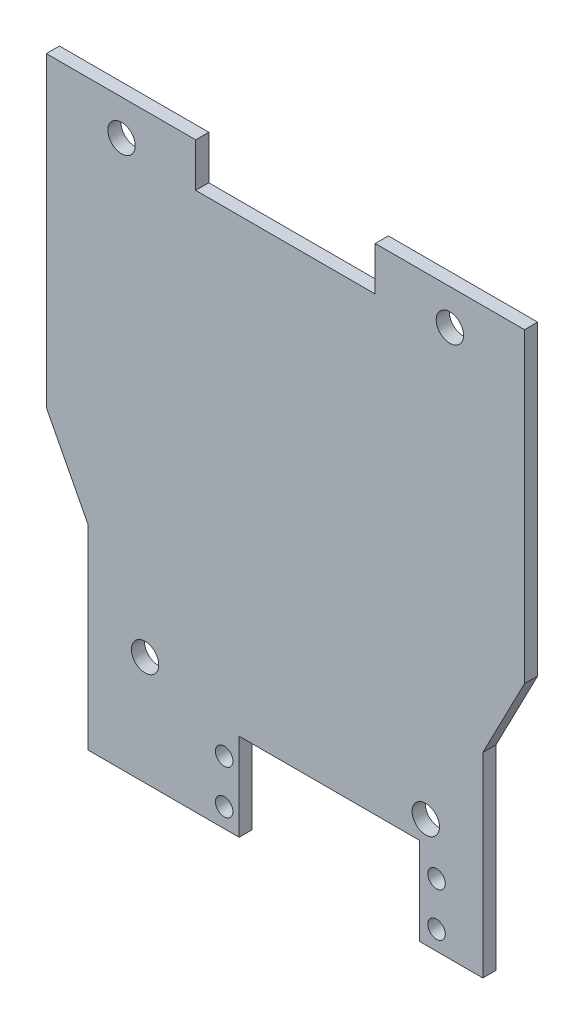
ISO-10303-21;
HEADER;
FILE_DESCRIPTION(('STEP AP214'),'2;1');
FILE_NAME('part.step','',(''),(''),'','','');
FILE_SCHEMA(('AUTOMOTIVE_DESIGN { 1 0 10303 214 1 1 1 1 }'));
ENDSEC;
DATA;
#1=APPLICATION_CONTEXT('core data for automotive mechanical design processes');
#2=APPLICATION_PROTOCOL_DEFINITION('international standard','automotive_design',2000,#1);
#3=PRODUCT_CONTEXT('',#1,'mechanical');
#4=PRODUCT('Part','Part','',(#3));
#5=PRODUCT_RELATED_PRODUCT_CATEGORY('part','',(#4));
#6=PRODUCT_DEFINITION_FORMATION('','',#4);
#7=PRODUCT_DEFINITION_CONTEXT('part definition',#1,'design');
#8=PRODUCT_DEFINITION('design','',#6,#7);
#9=PRODUCT_DEFINITION_SHAPE('','',#8);
#10=(LENGTH_UNIT() NAMED_UNIT(*) SI_UNIT(.MILLI.,.METRE.));
#11=(NAMED_UNIT(*) PLANE_ANGLE_UNIT() SI_UNIT($,.RADIAN.));
#12=(NAMED_UNIT(*) SI_UNIT($,.STERADIAN.) SOLID_ANGLE_UNIT());
#13=UNCERTAINTY_MEASURE_WITH_UNIT(LENGTH_MEASURE(1.E-05),#10,'distance_accuracy_value','');
#14=(GEOMETRIC_REPRESENTATION_CONTEXT(3) GLOBAL_UNCERTAINTY_ASSIGNED_CONTEXT((#13)) GLOBAL_UNIT_ASSIGNED_CONTEXT((#10,
#11,#12)) REPRESENTATION_CONTEXT('',''));
#15=CARTESIAN_POINT('',(0.,0.,0.));
#16=DIRECTION('',(0.,0.,1.));
#17=DIRECTION('',(1.,0.,0.));
#18=AXIS2_PLACEMENT_3D('',#15,#16,#17);
#19=CARTESIAN_POINT('',(0.,0.,3.));
#20=DIRECTION('',(0.,0.,1.));
#21=DIRECTION('',(1.,0.,0.));
#22=AXIS2_PLACEMENT_3D('',#19,#20,#21);
#23=PLANE('',#22);
#24=CARTESIAN_POINT('',(69.5000001755449,-100.000011832947,3.));
#25=DIRECTION('',(0.,0.,1.));
#26=DIRECTION('',(1.,0.,0.));
#27=AXIS2_PLACEMENT_3D('',#24,#25,#26);
#28=CIRCLE('',#27,3.125);
#29=CARTESIAN_POINT('',(66.3750001755449,-100.000011832947,3.));
#30=VERTEX_POINT('',#29);
#31=EDGE_CURVE('E408',#30,#30,#28,.F.);
#32=ORIENTED_EDGE('',*,*,#31,.T.);
#33=EDGE_LOOP('',(#32));
#34=FACE_BOUND('',#33,.T.);
#35=CARTESIAN_POINT('',(5.38797365053294,-100.000011832947,3.));
#36=DIRECTION('',(0.,0.,1.));
#37=DIRECTION('',(1.,0.,0.));
#38=AXIS2_PLACEMENT_3D('',#35,#36,#37);
#39=CIRCLE('',#38,3.125);
#40=CARTESIAN_POINT('',(2.26297365053294,-100.000011832947,3.));
#41=VERTEX_POINT('',#40);
#42=EDGE_CURVE('E420',#41,#41,#39,.F.);
#43=ORIENTED_EDGE('',*,*,#42,.T.);
#44=EDGE_LOOP('',(#43));
#45=FACE_BOUND('',#44,.T.);
#46=CARTESIAN_POINT('',(71.9515141755449,-110.541227832947,3.));
#47=DIRECTION('',(0.,0.,1.));
#48=DIRECTION('',(1.,0.,0.));
#49=AXIS2_PLACEMENT_3D('',#46,#47,#48);
#50=CIRCLE('',#49,2.);
#51=CARTESIAN_POINT('',(73.9515141755449,-110.541227832947,3.));
#52=VERTEX_POINT('',#51);
#53=EDGE_CURVE('E435',#52,#52,#50,.T.);
#54=ORIENTED_EDGE('',*,*,#53,.F.);
#55=EDGE_LOOP('',(#54));
#56=FACE_BOUND('',#55,.T.);
#57=CARTESIAN_POINT('',(23.4551051755449,-120.540427832947,3.));
#58=DIRECTION('',(0.,0.,1.));
#59=DIRECTION('',(1.,0.,0.));
#60=AXIS2_PLACEMENT_3D('',#57,#58,#59);
#61=CIRCLE('',#60,2.);
#62=CARTESIAN_POINT('',(25.4551051755449,-120.540427832947,3.));
#63=VERTEX_POINT('',#62);
#64=EDGE_CURVE('E436',#63,#63,#61,.T.);
#65=ORIENTED_EDGE('',*,*,#64,.F.);
#66=EDGE_LOOP('',(#65));
#67=FACE_BOUND('',#66,.T.);
#68=CARTESIAN_POINT('',(23.4551051755449,-110.541227832947,3.));
#69=DIRECTION('',(0.,0.,1.));
#70=DIRECTION('',(1.,0.,0.));
#71=AXIS2_PLACEMENT_3D('',#68,#69,#70);
#72=CIRCLE('',#71,2.);
#73=CARTESIAN_POINT('',(25.4551051755449,-110.541227832947,3.));
#74=VERTEX_POINT('',#73);
#75=EDGE_CURVE('E415',#74,#74,#72,.T.);
#76=ORIENTED_EDGE('',*,*,#75,.F.);
#77=EDGE_LOOP('',(#76));
#78=FACE_BOUND('',#77,.T.);
#79=CARTESIAN_POINT('',(71.9515141755449,-120.540427832947,3.));
#80=DIRECTION('',(0.,0.,1.));
#81=DIRECTION('',(1.,0.,0.));
#82=AXIS2_PLACEMENT_3D('',#79,#80,#81);
#83=CIRCLE('',#82,2.);
#84=CARTESIAN_POINT('',(73.9515141755449,-120.540427832947,3.));
#85=VERTEX_POINT('',#84);
#86=EDGE_CURVE('E440',#85,#85,#83,.T.);
#87=ORIENTED_EDGE('',*,*,#86,.F.);
#88=EDGE_LOOP('',(#87));
#89=FACE_BOUND('',#88,.T.);
#90=CARTESIAN_POINT('',(0.,0.,3.));
#91=DIRECTION('',(0.,0.,1.));
#92=DIRECTION('',(1.,0.,0.));
#93=AXIS2_PLACEMENT_3D('',#90,#91,#92);
#94=CIRCLE('',#93,3.125);
#95=CARTESIAN_POINT('',(3.125,0.,3.));
#96=VERTEX_POINT('',#95);
#97=EDGE_CURVE('E198',#96,#96,#94,.T.);
#98=ORIENTED_EDGE('',*,*,#97,.F.);
#99=EDGE_LOOP('',(#98));
#100=FACE_BOUND('',#99,.T.);
#101=DIRECTION('',(0.460085189661365,0.887874776223689,0.));
#102=VECTOR('',#101,1.);
#103=CARTESIAN_POINT('',(92.055,-61.8979118329466,3.));
#104=LINE('',#103,#102);
#105=CARTESIAN_POINT('',(82.5251141755449,-80.2887347369683,3.));
#106=VERTEX_POINT('',#105);
#107=CARTESIAN_POINT('',(92.055,-61.8979118329466,3.));
#108=VERTEX_POINT('',#107);
#109=EDGE_CURVE('E240',#106,#108,#104,.T.);
#110=ORIENTED_EDGE('',*,*,#109,.T.);
#111=DIRECTION('',(0.,1.,0.));
#112=VECTOR('',#111,1.);
#113=CARTESIAN_POINT('',(92.055,8.10208816705338,3.));
#114=LINE('',#113,#112);
#115=CARTESIAN_POINT('',(92.055,8.10208816705338,3.));
#116=VERTEX_POINT('',#115);
#117=EDGE_CURVE('E128',#108,#116,#114,.T.);
#118=ORIENTED_EDGE('',*,*,#117,.T.);
#119=DIRECTION('',(-1.,0.,0.));
#120=VECTOR('',#119,1.);
#121=CARTESIAN_POINT('',(57.945,8.10208816705338,3.));
#122=LINE('',#121,#120);
#123=CARTESIAN_POINT('',(57.945,8.10208816705338,3.));
#124=VERTEX_POINT('',#123);
#125=EDGE_CURVE('E293',#116,#124,#122,.T.);
#126=ORIENTED_EDGE('',*,*,#125,.T.);
#127=DIRECTION('',(0.,-1.,0.));
#128=VECTOR('',#127,1.);
#129=CARTESIAN_POINT('',(57.945,-1.89791183294662,3.));
#130=LINE('',#129,#128);
#131=CARTESIAN_POINT('',(57.945,-1.89791183294662,3.));
#132=VERTEX_POINT('',#131);
#133=EDGE_CURVE('E313',#124,#132,#130,.T.);
#134=ORIENTED_EDGE('',*,*,#133,.T.);
#135=DIRECTION('',(-1.,0.,0.));
#136=VECTOR('',#135,1.);
#137=CARTESIAN_POINT('',(16.9429738260778,-1.89791183294662,3.));
#138=LINE('',#137,#136);
#139=CARTESIAN_POINT('',(16.9429738260778,-1.89791183294662,3.));
#140=VERTEX_POINT('',#139);
#141=EDGE_CURVE('E309',#132,#140,#138,.T.);
#142=ORIENTED_EDGE('',*,*,#141,.T.);
#143=DIRECTION('',(0.,1.,0.));
#144=VECTOR('',#143,1.);
#145=CARTESIAN_POINT('',(16.9429738260778,-1.89791183294662,3.));
#146=LINE('',#145,#144);
#147=CARTESIAN_POINT('',(16.9429738260778,8.10208816705338,3.));
#148=VERTEX_POINT('',#147);
#149=EDGE_CURVE('E312',#140,#148,#146,.T.);
#150=ORIENTED_EDGE('',*,*,#149,.T.);
#151=DIRECTION('',(-1.,0.,0.));
#152=VECTOR('',#151,1.);
#153=CARTESIAN_POINT('',(-17.1710785217665,8.10208816705338,3.));
#154=LINE('',#153,#152);
#155=CARTESIAN_POINT('',(-17.1710785217665,8.10208816705338,3.));
#156=VERTEX_POINT('',#155);
#157=EDGE_CURVE('E317',#148,#156,#154,.T.);
#158=ORIENTED_EDGE('',*,*,#157,.T.);
#159=DIRECTION('',(0.,-1.,0.));
#160=VECTOR('',#159,1.);
#161=CARTESIAN_POINT('',(-17.1710785217665,-61.8979118329466,3.));
#162=LINE('',#161,#160);
#163=CARTESIAN_POINT('',(-17.1710785217665,-61.8979118329466,3.));
#164=VERTEX_POINT('',#163);
#165=EDGE_CURVE('E324',#156,#164,#162,.T.);
#166=ORIENTED_EDGE('',*,*,#165,.T.);
#167=DIRECTION('',(0.460085189661365,-0.887874776223689,0.));
#168=VECTOR('',#167,1.);
#169=CARTESIAN_POINT('',(-17.1710785217665,-61.8979118329466,3.));
#170=LINE('',#169,#168);
#171=CARTESIAN_POINT('',(-7.64119269731139,-80.2887347369683,3.));
#172=VERTEX_POINT('',#171);
#173=EDGE_CURVE('E327',#164,#172,#170,.T.);
#174=ORIENTED_EDGE('',*,*,#173,.T.);
#175=DIRECTION('',(0.,-1.,0.));
#176=VECTOR('',#175,1.);
#177=CARTESIAN_POINT('',(-7.64119269731139,-124.897911832947,3.));
#178=LINE('',#177,#176);
#179=CARTESIAN_POINT('',(-7.64119269731139,-124.897911832947,3.));
#180=VERTEX_POINT('',#179);
#181=EDGE_CURVE('E330',#172,#180,#178,.T.);
#182=ORIENTED_EDGE('',*,*,#181,.T.);
#183=DIRECTION('',(1.,0.,0.));
#184=VECTOR('',#183,1.);
#185=CARTESIAN_POINT('',(-7.64119269731139,-124.897911832947,3.));
#186=LINE('',#185,#184);
#187=CARTESIAN_POINT('',(26.8588073026886,-124.897911832947,3.));
#188=VERTEX_POINT('',#187);
#189=EDGE_CURVE('E333',#180,#188,#186,.T.);
#190=ORIENTED_EDGE('',*,*,#189,.T.);
#191=DIRECTION('',(0.,1.,0.));
#192=VECTOR('',#191,1.);
#193=CARTESIAN_POINT('',(26.8588073026886,-124.897911832947,3.));
#194=LINE('',#193,#192);
#195=CARTESIAN_POINT('',(26.8588073026886,-104.897911832947,3.));
#196=VERTEX_POINT('',#195);
#197=EDGE_CURVE('E336',#188,#196,#194,.T.);
#198=ORIENTED_EDGE('',*,*,#197,.T.);
#199=DIRECTION('',(1.,0.,0.));
#200=VECTOR('',#199,1.);
#201=CARTESIAN_POINT('',(68.0251141755449,-104.897911832947,3.));
#202=LINE('',#201,#200);
#203=CARTESIAN_POINT('',(68.0251141755449,-104.897911832947,3.));
#204=VERTEX_POINT('',#203);
#205=EDGE_CURVE('E171',#196,#204,#202,.T.);
#206=ORIENTED_EDGE('',*,*,#205,.T.);
#207=DIRECTION('',(0.,-1.,0.));
#208=VECTOR('',#207,1.);
#209=CARTESIAN_POINT('',(68.0251141755449,-124.897911832947,3.));
#210=LINE('',#209,#208);
#211=CARTESIAN_POINT('',(68.0251141755449,-124.897911832947,3.));
#212=VERTEX_POINT('',#211);
#213=EDGE_CURVE('E165',#204,#212,#210,.T.);
#214=ORIENTED_EDGE('',*,*,#213,.T.);
#215=DIRECTION('',(1.,0.,0.));
#216=VECTOR('',#215,1.);
#217=CARTESIAN_POINT('',(68.0251141755449,-124.897911832947,3.));
#218=LINE('',#217,#216);
#219=CARTESIAN_POINT('',(82.5251141755449,-124.897911832947,3.));
#220=VERTEX_POINT('',#219);
#221=EDGE_CURVE('E169',#212,#220,#218,.T.);
#222=ORIENTED_EDGE('',*,*,#221,.T.);
#223=DIRECTION('',(0.,1.,0.));
#224=VECTOR('',#223,1.);
#225=CARTESIAN_POINT('',(82.5251141755449,-80.2887347369683,3.));
#226=LINE('',#225,#224);
#227=EDGE_CURVE('E61',#220,#106,#226,.T.);
#228=ORIENTED_EDGE('',*,*,#227,.T.);
#229=EDGE_LOOP('',(#110,#118,#126,#134,#142,#150,#158,#166,#174,#182,#190,#198,#206,#214,#222,#228));
#230=FACE_BOUND('',#229,.T.);
#231=CARTESIAN_POINT('',(75.,0.,3.));
#232=DIRECTION('',(0.,0.,1.));
#233=DIRECTION('',(1.,0.,0.));
#234=AXIS2_PLACEMENT_3D('',#231,#232,#233);
#235=CIRCLE('',#234,3.125);
#236=CARTESIAN_POINT('',(78.125,0.,3.));
#237=VERTEX_POINT('',#236);
#238=EDGE_CURVE('E455',#237,#237,#235,.T.);
#239=ORIENTED_EDGE('',*,*,#238,.F.);
#240=EDGE_LOOP('',(#239));
#241=FACE_BOUND('',#240,.T.);
#242=ADVANCED_FACE('F43',(#34,#45,#56,#67,#78,#89,#100,#230,#241),#23,.T.);
#243=CARTESIAN_POINT('',(0.,0.,0.));
#244=DIRECTION('',(0.,0.,1.));
#245=DIRECTION('',(1.,0.,0.));
#246=AXIS2_PLACEMENT_3D('',#243,#244,#245);
#247=PLANE('',#246);
#248=CARTESIAN_POINT('',(69.5000001755449,-100.000011832947,0.));
#249=DIRECTION('',(0.,0.,-1.));
#250=DIRECTION('',(-1.,0.,0.));
#251=AXIS2_PLACEMENT_3D('',#248,#249,#250);
#252=CIRCLE('',#251,3.125);
#253=CARTESIAN_POINT('',(66.3750001755449,-100.000011832947,0.));
#254=VERTEX_POINT('',#253);
#255=EDGE_CURVE('E406',#254,#254,#252,.T.);
#256=ORIENTED_EDGE('',*,*,#255,.F.);
#257=EDGE_LOOP('',(#256));
#258=FACE_BOUND('',#257,.T.);
#259=CARTESIAN_POINT('',(5.38797365053294,-100.000011832947,0.));
#260=DIRECTION('',(0.,0.,-1.));
#261=DIRECTION('',(1.,0.,0.));
#262=AXIS2_PLACEMENT_3D('',#259,#260,#261);
#263=CIRCLE('',#262,3.125);
#264=CARTESIAN_POINT('',(2.26297365053294,-100.000011832947,0.));
#265=VERTEX_POINT('',#264);
#266=EDGE_CURVE('E417',#265,#265,#263,.T.);
#267=ORIENTED_EDGE('',*,*,#266,.F.);
#268=EDGE_LOOP('',(#267));
#269=FACE_BOUND('',#268,.T.);
#270=CARTESIAN_POINT('',(71.9515141755449,-110.541227832947,0.));
#271=DIRECTION('',(0.,0.,1.));
#272=DIRECTION('',(1.,0.,0.));
#273=AXIS2_PLACEMENT_3D('',#270,#271,#272);
#274=CIRCLE('',#273,2.);
#275=CARTESIAN_POINT('',(73.9515141755449,-110.541227832947,0.));
#276=VERTEX_POINT('',#275);
#277=EDGE_CURVE('E431',#276,#276,#274,.F.);
#278=ORIENTED_EDGE('',*,*,#277,.F.);
#279=EDGE_LOOP('',(#278));
#280=FACE_BOUND('',#279,.T.);
#281=CARTESIAN_POINT('',(23.4551051755449,-120.540427832947,0.));
#282=DIRECTION('',(0.,0.,1.));
#283=DIRECTION('',(1.,0.,0.));
#284=AXIS2_PLACEMENT_3D('',#281,#282,#283);
#285=CIRCLE('',#284,2.);
#286=CARTESIAN_POINT('',(25.4551051755449,-120.540427832947,0.));
#287=VERTEX_POINT('',#286);
#288=EDGE_CURVE('E430',#287,#287,#285,.F.);
#289=ORIENTED_EDGE('',*,*,#288,.F.);
#290=EDGE_LOOP('',(#289));
#291=FACE_BOUND('',#290,.T.);
#292=CARTESIAN_POINT('',(23.4551051755449,-110.541227832947,0.));
#293=DIRECTION('',(0.,0.,1.));
#294=DIRECTION('',(1.,0.,0.));
#295=AXIS2_PLACEMENT_3D('',#292,#293,#294);
#296=CIRCLE('',#295,2.);
#297=CARTESIAN_POINT('',(25.4551051755449,-110.541227832947,0.));
#298=VERTEX_POINT('',#297);
#299=EDGE_CURVE('E410',#298,#298,#296,.F.);
#300=ORIENTED_EDGE('',*,*,#299,.F.);
#301=EDGE_LOOP('',(#300));
#302=FACE_BOUND('',#301,.T.);
#303=CARTESIAN_POINT('',(71.9515141755449,-120.540427832947,0.));
#304=DIRECTION('',(0.,0.,1.));
#305=DIRECTION('',(1.,0.,0.));
#306=AXIS2_PLACEMENT_3D('',#303,#304,#305);
#307=CIRCLE('',#306,2.);
#308=CARTESIAN_POINT('',(73.9515141755449,-120.540427832947,0.));
#309=VERTEX_POINT('',#308);
#310=EDGE_CURVE('E450',#309,#309,#307,.F.);
#311=ORIENTED_EDGE('',*,*,#310,.F.);
#312=EDGE_LOOP('',(#311));
#313=FACE_BOUND('',#312,.T.);
#314=DIRECTION('',(0.460085189661365,0.887874776223689,0.));
#315=VECTOR('',#314,1.);
#316=CARTESIAN_POINT('',(92.055,-61.8979118329466,0.));
#317=LINE('',#316,#315);
#318=CARTESIAN_POINT('',(82.5251141755449,-80.2887347369683,0.));
#319=VERTEX_POINT('',#318);
#320=CARTESIAN_POINT('',(92.055,-61.8979118329466,0.));
#321=VERTEX_POINT('',#320);
#322=EDGE_CURVE('E193',#319,#321,#317,.T.);
#323=ORIENTED_EDGE('',*,*,#322,.F.);
#324=DIRECTION('',(0.,1.,0.));
#325=VECTOR('',#324,1.);
#326=CARTESIAN_POINT('',(82.5251141755449,-80.2887347369683,0.));
#327=LINE('',#326,#325);
#328=CARTESIAN_POINT('',(82.5251141755449,-124.897911832947,0.));
#329=VERTEX_POINT('',#328);
#330=EDGE_CURVE('E120',#329,#319,#327,.T.);
#331=ORIENTED_EDGE('',*,*,#330,.F.);
#332=DIRECTION('',(1.,0.,0.));
#333=VECTOR('',#332,1.);
#334=CARTESIAN_POINT('',(68.0251141755449,-124.897911832947,0.));
#335=LINE('',#334,#333);
#336=CARTESIAN_POINT('',(68.0251141755449,-124.897911832947,0.));
#337=VERTEX_POINT('',#336);
#338=EDGE_CURVE('E114',#337,#329,#335,.T.);
#339=ORIENTED_EDGE('',*,*,#338,.F.);
#340=DIRECTION('',(0.,-1.,0.));
#341=VECTOR('',#340,1.);
#342=CARTESIAN_POINT('',(68.0251141755449,-124.897911832947,0.));
#343=LINE('',#342,#341);
#344=CARTESIAN_POINT('',(68.0251141755449,-104.897911832947,0.));
#345=VERTEX_POINT('',#344);
#346=EDGE_CURVE('E180',#345,#337,#343,.T.);
#347=ORIENTED_EDGE('',*,*,#346,.F.);
#348=DIRECTION('',(1.,0.,0.));
#349=VECTOR('',#348,1.);
#350=CARTESIAN_POINT('',(68.0251141755449,-104.897911832947,0.));
#351=LINE('',#350,#349);
#352=CARTESIAN_POINT('',(26.8588073026886,-104.897911832947,0.));
#353=VERTEX_POINT('',#352);
#354=EDGE_CURVE('E231',#353,#345,#351,.T.);
#355=ORIENTED_EDGE('',*,*,#354,.F.);
#356=DIRECTION('',(0.,1.,0.));
#357=VECTOR('',#356,1.);
#358=CARTESIAN_POINT('',(26.8588073026886,-124.897911832947,0.));
#359=LINE('',#358,#357);
#360=CARTESIAN_POINT('',(26.8588073026886,-124.897911832947,0.));
#361=VERTEX_POINT('',#360);
#362=EDGE_CURVE('E228',#361,#353,#359,.T.);
#363=ORIENTED_EDGE('',*,*,#362,.F.);
#364=DIRECTION('',(1.,0.,0.));
#365=VECTOR('',#364,1.);
#366=CARTESIAN_POINT('',(-7.64119269731139,-124.897911832947,0.));
#367=LINE('',#366,#365);
#368=CARTESIAN_POINT('',(-7.64119269731139,-124.897911832947,0.));
#369=VERTEX_POINT('',#368);
#370=EDGE_CURVE('E225',#369,#361,#367,.T.);
#371=ORIENTED_EDGE('',*,*,#370,.F.);
#372=DIRECTION('',(0.,-1.,0.));
#373=VECTOR('',#372,1.);
#374=CARTESIAN_POINT('',(-7.64119269731139,-124.897911832947,0.));
#375=LINE('',#374,#373);
#376=CARTESIAN_POINT('',(-7.64119269731139,-80.2887347369683,0.));
#377=VERTEX_POINT('',#376);
#378=EDGE_CURVE('E222',#377,#369,#375,.T.);
#379=ORIENTED_EDGE('',*,*,#378,.F.);
#380=DIRECTION('',(0.460085189661365,-0.887874776223689,0.));
#381=VECTOR('',#380,1.);
#382=CARTESIAN_POINT('',(-17.1710785217665,-61.8979118329466,0.));
#383=LINE('',#382,#381);
#384=CARTESIAN_POINT('',(-17.1710785217665,-61.8979118329466,0.));
#385=VERTEX_POINT('',#384);
#386=EDGE_CURVE('E219',#385,#377,#383,.T.);
#387=ORIENTED_EDGE('',*,*,#386,.F.);
#388=DIRECTION('',(0.,-1.,0.));
#389=VECTOR('',#388,1.);
#390=CARTESIAN_POINT('',(-17.1710785217665,-61.8979118329466,0.));
#391=LINE('',#390,#389);
#392=CARTESIAN_POINT('',(-17.1710785217665,8.10208816705338,0.));
#393=VERTEX_POINT('',#392);
#394=EDGE_CURVE('E216',#393,#385,#391,.T.);
#395=ORIENTED_EDGE('',*,*,#394,.F.);
#396=DIRECTION('',(-1.,0.,0.));
#397=VECTOR('',#396,1.);
#398=CARTESIAN_POINT('',(-17.1710785217665,8.10208816705338,0.));
#399=LINE('',#398,#397);
#400=CARTESIAN_POINT('',(16.9429738260778,8.10208816705338,0.));
#401=VERTEX_POINT('',#400);
#402=EDGE_CURVE('E213',#401,#393,#399,.T.);
#403=ORIENTED_EDGE('',*,*,#402,.F.);
#404=DIRECTION('',(0.,1.,0.));
#405=VECTOR('',#404,1.);
#406=CARTESIAN_POINT('',(16.9429738260778,-1.89791183294662,0.));
#407=LINE('',#406,#405);
#408=CARTESIAN_POINT('',(16.9429738260778,-1.89791183294662,0.));
#409=VERTEX_POINT('',#408);
#410=EDGE_CURVE('E210',#409,#401,#407,.T.);
#411=ORIENTED_EDGE('',*,*,#410,.F.);
#412=DIRECTION('',(-1.,0.,0.));
#413=VECTOR('',#412,1.);
#414=CARTESIAN_POINT('',(16.9429738260778,-1.89791183294662,0.));
#415=LINE('',#414,#413);
#416=CARTESIAN_POINT('',(57.945,-1.89791183294662,0.));
#417=VERTEX_POINT('',#416);
#418=EDGE_CURVE('E207',#417,#409,#415,.T.);
#419=ORIENTED_EDGE('',*,*,#418,.F.);
#420=DIRECTION('',(0.,-1.,0.));
#421=VECTOR('',#420,1.);
#422=CARTESIAN_POINT('',(57.945,-1.89791183294662,0.));
#423=LINE('',#422,#421);
#424=CARTESIAN_POINT('',(57.945,8.10208816705338,0.));
#425=VERTEX_POINT('',#424);
#426=EDGE_CURVE('E204',#425,#417,#423,.T.);
#427=ORIENTED_EDGE('',*,*,#426,.F.);
#428=DIRECTION('',(-1.,0.,0.));
#429=VECTOR('',#428,1.);
#430=CARTESIAN_POINT('',(57.945,8.10208816705338,0.));
#431=LINE('',#430,#429);
#432=CARTESIAN_POINT('',(92.055,8.10208816705338,0.));
#433=VERTEX_POINT('',#432);
#434=EDGE_CURVE('E201',#433,#425,#431,.T.);
#435=ORIENTED_EDGE('',*,*,#434,.F.);
#436=DIRECTION('',(0.,1.,0.));
#437=VECTOR('',#436,1.);
#438=CARTESIAN_POINT('',(92.055,8.10208816705338,0.));
#439=LINE('',#438,#437);
#440=EDGE_CURVE('E197',#321,#433,#439,.T.);
#441=ORIENTED_EDGE('',*,*,#440,.F.);
#442=EDGE_LOOP('',(#323,#331,#339,#347,#355,#363,#371,#379,#387,#395,#403,#411,#419,#427,#435,#441));
#443=FACE_BOUND('',#442,.T.);
#444=CARTESIAN_POINT('',(0.,0.,0.));
#445=DIRECTION('',(0.,0.,1.));
#446=DIRECTION('',(1.,0.,0.));
#447=AXIS2_PLACEMENT_3D('',#444,#445,#446);
#448=CIRCLE('',#447,3.125);
#449=CARTESIAN_POINT('',(3.125,0.,0.));
#450=VERTEX_POINT('',#449);
#451=EDGE_CURVE('E459',#450,#450,#448,.T.);
#452=ORIENTED_EDGE('',*,*,#451,.T.);
#453=EDGE_LOOP('',(#452));
#454=FACE_BOUND('',#453,.T.);
#455=CARTESIAN_POINT('',(75.,0.,0.));
#456=DIRECTION('',(0.,0.,1.));
#457=DIRECTION('',(1.,0.,0.));
#458=AXIS2_PLACEMENT_3D('',#455,#456,#457);
#459=CIRCLE('',#458,3.125);
#460=CARTESIAN_POINT('',(78.125,0.,0.));
#461=VERTEX_POINT('',#460);
#462=EDGE_CURVE('E454',#461,#461,#459,.T.);
#463=ORIENTED_EDGE('',*,*,#462,.T.);
#464=EDGE_LOOP('',(#463));
#465=FACE_BOUND('',#464,.T.);
#466=ADVANCED_FACE('F297',(#258,#269,#280,#291,#302,#313,#443,#454,#465),#247,.F.);
#467=CARTESIAN_POINT('',(92.055,-61.8979118329466,3.));
#468=DIRECTION('',(-0.887874776223689,0.460085189661365,0.));
#469=DIRECTION('',(-0.460085189661365,-0.887874776223689,0.));
#470=AXIS2_PLACEMENT_3D('',#467,#468,#469);
#471=PLANE('',#470);
#472=ORIENTED_EDGE('',*,*,#322,.T.);
#473=DIRECTION('',(0.,0.,-1.));
#474=VECTOR('',#473,1.);
#475=CARTESIAN_POINT('',(92.055,-61.8979118329466,3.));
#476=LINE('',#475,#474);
#477=EDGE_CURVE('E11',#108,#321,#476,.T.);
#478=ORIENTED_EDGE('',*,*,#477,.F.);
#479=ORIENTED_EDGE('',*,*,#109,.F.);
#480=DIRECTION('',(0.,0.,-1.));
#481=VECTOR('',#480,1.);
#482=CARTESIAN_POINT('',(82.5251141755449,-80.2887347369683,3.));
#483=LINE('',#482,#481);
#484=EDGE_CURVE('E189',#106,#319,#483,.T.);
#485=ORIENTED_EDGE('',*,*,#484,.T.);
#486=EDGE_LOOP('',(#472,#478,#479,#485));
#487=FACE_BOUND('',#486,.T.);
#488=ADVANCED_FACE('F45',(#487),#471,.F.);
#489=CARTESIAN_POINT('',(92.055,8.10208816705338,3.));
#490=DIRECTION('',(-1.,0.,0.));
#491=DIRECTION('',(0.,0.,1.));
#492=AXIS2_PLACEMENT_3D('',#489,#490,#491);
#493=PLANE('',#492);
#494=ORIENTED_EDGE('',*,*,#440,.T.);
#495=DIRECTION('',(0.,0.,-1.));
#496=VECTOR('',#495,1.);
#497=CARTESIAN_POINT('',(92.055,8.10208816705338,3.));
#498=LINE('',#497,#496);
#499=EDGE_CURVE('E53',#116,#433,#498,.T.);
#500=ORIENTED_EDGE('',*,*,#499,.F.);
#501=ORIENTED_EDGE('',*,*,#117,.F.);
#502=ORIENTED_EDGE('',*,*,#477,.T.);
#503=EDGE_LOOP('',(#494,#500,#501,#502));
#504=FACE_BOUND('',#503,.T.);
#505=ADVANCED_FACE('F529',(#504),#493,.F.);
#506=CARTESIAN_POINT('',(57.945,8.10208816705338,3.));
#507=DIRECTION('',(0.,-1.,0.));
#508=DIRECTION('',(0.,0.,-1.));
#509=AXIS2_PLACEMENT_3D('',#506,#507,#508);
#510=PLANE('',#509);
#511=ORIENTED_EDGE('',*,*,#434,.T.);
#512=DIRECTION('',(0.,0.,-1.));
#513=VECTOR('',#512,1.);
#514=CARTESIAN_POINT('',(57.945,8.10208816705338,3.));
#515=LINE('',#514,#513);
#516=EDGE_CURVE('E283',#124,#425,#515,.T.);
#517=ORIENTED_EDGE('',*,*,#516,.F.);
#518=ORIENTED_EDGE('',*,*,#125,.F.);
#519=ORIENTED_EDGE('',*,*,#499,.T.);
#520=EDGE_LOOP('',(#511,#517,#518,#519));
#521=FACE_BOUND('',#520,.T.);
#522=ADVANCED_FACE('F291',(#521),#510,.F.);
#523=CARTESIAN_POINT('',(57.945,-1.89791183294662,3.));
#524=DIRECTION('',(1.,0.,0.));
#525=DIRECTION('',(0.,0.,-1.));
#526=AXIS2_PLACEMENT_3D('',#523,#524,#525);
#527=PLANE('',#526);
#528=ORIENTED_EDGE('',*,*,#426,.T.);
#529=DIRECTION('',(0.,0.,-1.));
#530=VECTOR('',#529,1.);
#531=CARTESIAN_POINT('',(57.945,-1.89791183294662,3.));
#532=LINE('',#531,#530);
#533=EDGE_CURVE('E279',#132,#417,#532,.T.);
#534=ORIENTED_EDGE('',*,*,#533,.F.);
#535=ORIENTED_EDGE('',*,*,#133,.F.);
#536=ORIENTED_EDGE('',*,*,#516,.T.);
#537=EDGE_LOOP('',(#528,#534,#535,#536));
#538=FACE_BOUND('',#537,.T.);
#539=ADVANCED_FACE('F303',(#538),#527,.F.);
#540=CARTESIAN_POINT('',(16.9429738260778,-1.89791183294662,3.));
#541=DIRECTION('',(0.,-1.,0.));
#542=DIRECTION('',(0.,0.,-1.));
#543=AXIS2_PLACEMENT_3D('',#540,#541,#542);
#544=PLANE('',#543);
#545=ORIENTED_EDGE('',*,*,#418,.T.);
#546=DIRECTION('',(0.,0.,-1.));
#547=VECTOR('',#546,1.);
#548=CARTESIAN_POINT('',(16.9429738260778,-1.89791183294662,3.));
#549=LINE('',#548,#547);
#550=EDGE_CURVE('E275',#140,#409,#549,.T.);
#551=ORIENTED_EDGE('',*,*,#550,.F.);
#552=ORIENTED_EDGE('',*,*,#141,.F.);
#553=ORIENTED_EDGE('',*,*,#533,.T.);
#554=EDGE_LOOP('',(#545,#551,#552,#553));
#555=FACE_BOUND('',#554,.T.);
#556=ADVANCED_FACE('F307',(#555),#544,.F.);
#557=CARTESIAN_POINT('',(16.9429738260778,-1.89791183294662,3.));
#558=DIRECTION('',(-1.,0.,0.));
#559=DIRECTION('',(0.,0.,1.));
#560=AXIS2_PLACEMENT_3D('',#557,#558,#559);
#561=PLANE('',#560);
#562=ORIENTED_EDGE('',*,*,#410,.T.);
#563=DIRECTION('',(0.,0.,-1.));
#564=VECTOR('',#563,1.);
#565=CARTESIAN_POINT('',(16.9429738260778,8.10208816705338,3.));
#566=LINE('',#565,#564);
#567=EDGE_CURVE('E271',#148,#401,#566,.T.);
#568=ORIENTED_EDGE('',*,*,#567,.F.);
#569=ORIENTED_EDGE('',*,*,#149,.F.);
#570=ORIENTED_EDGE('',*,*,#550,.T.);
#571=EDGE_LOOP('',(#562,#568,#569,#570));
#572=FACE_BOUND('',#571,.T.);
#573=ADVANCED_FACE('F560',(#572),#561,.F.);
#574=CARTESIAN_POINT('',(-17.1710785217665,8.10208816705338,3.));
#575=DIRECTION('',(0.,-1.,0.));
#576=DIRECTION('',(0.,0.,-1.));
#577=AXIS2_PLACEMENT_3D('',#574,#575,#576);
#578=PLANE('',#577);
#579=ORIENTED_EDGE('',*,*,#402,.T.);
#580=DIRECTION('',(0.,0.,-1.));
#581=VECTOR('',#580,1.);
#582=CARTESIAN_POINT('',(-17.1710785217665,8.10208816705338,3.));
#583=LINE('',#582,#581);
#584=EDGE_CURVE('E267',#156,#393,#583,.T.);
#585=ORIENTED_EDGE('',*,*,#584,.F.);
#586=ORIENTED_EDGE('',*,*,#157,.F.);
#587=ORIENTED_EDGE('',*,*,#567,.T.);
#588=EDGE_LOOP('',(#579,#585,#586,#587));
#589=FACE_BOUND('',#588,.T.);
#590=ADVANCED_FACE('F569',(#589),#578,.F.);
#591=CARTESIAN_POINT('',(-17.1710785217665,-61.8979118329466,3.));
#592=DIRECTION('',(1.,0.,0.));
#593=DIRECTION('',(0.,1.,0.));
#594=AXIS2_PLACEMENT_3D('',#591,#592,#593);
#595=PLANE('',#594);
#596=ORIENTED_EDGE('',*,*,#394,.T.);
#597=DIRECTION('',(0.,0.,-1.));
#598=VECTOR('',#597,1.);
#599=CARTESIAN_POINT('',(-17.1710785217665,-61.8979118329466,3.));
#600=LINE('',#599,#598);
#601=EDGE_CURVE('E263',#164,#385,#600,.T.);
#602=ORIENTED_EDGE('',*,*,#601,.F.);
#603=ORIENTED_EDGE('',*,*,#165,.F.);
#604=ORIENTED_EDGE('',*,*,#584,.T.);
#605=EDGE_LOOP('',(#596,#602,#603,#604));
#606=FACE_BOUND('',#605,.T.);
#607=ADVANCED_FACE('F579',(#606),#595,.F.);
#608=CARTESIAN_POINT('',(-17.1710785217665,-61.8979118329466,3.));
#609=DIRECTION('',(0.887874776223689,0.460085189661365,0.));
#610=DIRECTION('',(-0.460085189661365,0.887874776223689,0.));
#611=AXIS2_PLACEMENT_3D('',#608,#609,#610);
#612=PLANE('',#611);
#613=ORIENTED_EDGE('',*,*,#386,.T.);
#614=DIRECTION('',(0.,0.,-1.));
#615=VECTOR('',#614,1.);
#616=CARTESIAN_POINT('',(-7.64119269731139,-80.2887347369683,3.));
#617=LINE('',#616,#615);
#618=EDGE_CURVE('E259',#172,#377,#617,.T.);
#619=ORIENTED_EDGE('',*,*,#618,.F.);
#620=ORIENTED_EDGE('',*,*,#173,.F.);
#621=ORIENTED_EDGE('',*,*,#601,.T.);
#622=EDGE_LOOP('',(#613,#619,#620,#621));
#623=FACE_BOUND('',#622,.T.);
#624=ADVANCED_FACE('F589',(#623),#612,.F.);
#625=CARTESIAN_POINT('',(-7.64119269731139,-124.897911832947,3.));
#626=DIRECTION('',(1.,0.,0.));
#627=DIRECTION('',(0.,1.,0.));
#628=AXIS2_PLACEMENT_3D('',#625,#626,#627);
#629=PLANE('',#628);
#630=ORIENTED_EDGE('',*,*,#378,.T.);
#631=DIRECTION('',(0.,0.,-1.));
#632=VECTOR('',#631,1.);
#633=CARTESIAN_POINT('',(-7.64119269731139,-124.897911832947,3.));
#634=LINE('',#633,#632);
#635=EDGE_CURVE('E255',#180,#369,#634,.T.);
#636=ORIENTED_EDGE('',*,*,#635,.F.);
#637=ORIENTED_EDGE('',*,*,#181,.F.);
#638=ORIENTED_EDGE('',*,*,#618,.T.);
#639=EDGE_LOOP('',(#630,#636,#637,#638));
#640=FACE_BOUND('',#639,.T.);
#641=ADVANCED_FACE('F599',(#640),#629,.F.);
#642=CARTESIAN_POINT('',(-7.64119269731139,-124.897911832947,3.));
#643=DIRECTION('',(0.,1.,0.));
#644=DIRECTION('',(0.,0.,1.));
#645=AXIS2_PLACEMENT_3D('',#642,#643,#644);
#646=PLANE('',#645);
#647=ORIENTED_EDGE('',*,*,#370,.T.);
#648=DIRECTION('',(0.,0.,-1.));
#649=VECTOR('',#648,1.);
#650=CARTESIAN_POINT('',(26.8588073026886,-124.897911832947,3.));
#651=LINE('',#650,#649);
#652=EDGE_CURVE('E251',#188,#361,#651,.T.);
#653=ORIENTED_EDGE('',*,*,#652,.F.);
#654=ORIENTED_EDGE('',*,*,#189,.F.);
#655=ORIENTED_EDGE('',*,*,#635,.T.);
#656=EDGE_LOOP('',(#647,#653,#654,#655));
#657=FACE_BOUND('',#656,.T.);
#658=ADVANCED_FACE('F609',(#657),#646,.F.);
#659=CARTESIAN_POINT('',(26.8588073026886,-124.897911832947,3.));
#660=DIRECTION('',(-1.,0.,0.));
#661=DIRECTION('',(0.,0.,1.));
#662=AXIS2_PLACEMENT_3D('',#659,#660,#661);
#663=PLANE('',#662);
#664=ORIENTED_EDGE('',*,*,#362,.T.);
#665=DIRECTION('',(0.,0.,-1.));
#666=VECTOR('',#665,1.);
#667=CARTESIAN_POINT('',(26.8588073026886,-104.897911832947,3.));
#668=LINE('',#667,#666);
#669=EDGE_CURVE('E247',#196,#353,#668,.T.);
#670=ORIENTED_EDGE('',*,*,#669,.F.);
#671=ORIENTED_EDGE('',*,*,#197,.F.);
#672=ORIENTED_EDGE('',*,*,#652,.T.);
#673=EDGE_LOOP('',(#664,#670,#671,#672));
#674=FACE_BOUND('',#673,.T.);
#675=ADVANCED_FACE('F344',(#674),#663,.F.);
#676=CARTESIAN_POINT('',(68.0251141755449,-104.897911832947,3.));
#677=DIRECTION('',(0.,1.,0.));
#678=DIRECTION('',(0.,0.,1.));
#679=AXIS2_PLACEMENT_3D('',#676,#677,#678);
#680=PLANE('',#679);
#681=ORIENTED_EDGE('',*,*,#354,.T.);
#682=DIRECTION('',(0.,0.,-1.));
#683=VECTOR('',#682,1.);
#684=CARTESIAN_POINT('',(68.0251141755449,-104.897911832947,3.));
#685=LINE('',#684,#683);
#686=EDGE_CURVE('E182',#204,#345,#685,.T.);
#687=ORIENTED_EDGE('',*,*,#686,.F.);
#688=ORIENTED_EDGE('',*,*,#205,.F.);
#689=ORIENTED_EDGE('',*,*,#669,.T.);
#690=EDGE_LOOP('',(#681,#687,#688,#689));
#691=FACE_BOUND('',#690,.T.);
#692=ADVANCED_FACE('F348',(#691),#680,.F.);
#693=CARTESIAN_POINT('',(68.0251141755449,-124.897911832947,3.));
#694=DIRECTION('',(1.,0.,0.));
#695=DIRECTION('',(0.,0.,-1.));
#696=AXIS2_PLACEMENT_3D('',#693,#694,#695);
#697=PLANE('',#696);
#698=ORIENTED_EDGE('',*,*,#346,.T.);
#699=DIRECTION('',(0.,0.,-1.));
#700=VECTOR('',#699,1.);
#701=CARTESIAN_POINT('',(68.0251141755449,-124.897911832947,3.));
#702=LINE('',#701,#700);
#703=EDGE_CURVE('E177',#212,#337,#702,.T.);
#704=ORIENTED_EDGE('',*,*,#703,.F.);
#705=ORIENTED_EDGE('',*,*,#213,.F.);
#706=ORIENTED_EDGE('',*,*,#686,.T.);
#707=EDGE_LOOP('',(#698,#704,#705,#706));
#708=FACE_BOUND('',#707,.T.);
#709=ADVANCED_FACE('F178',(#708),#697,.F.);
#710=CARTESIAN_POINT('',(68.0251141755449,-124.897911832947,3.));
#711=DIRECTION('',(0.,1.,0.));
#712=DIRECTION('',(0.,0.,1.));
#713=AXIS2_PLACEMENT_3D('',#710,#711,#712);
#714=PLANE('',#713);
#715=ORIENTED_EDGE('',*,*,#338,.T.);
#716=DIRECTION('',(0.,0.,-1.));
#717=VECTOR('',#716,1.);
#718=CARTESIAN_POINT('',(82.5251141755449,-124.897911832947,3.));
#719=LINE('',#718,#717);
#720=EDGE_CURVE('E183',#220,#329,#719,.T.);
#721=ORIENTED_EDGE('',*,*,#720,.F.);
#722=ORIENTED_EDGE('',*,*,#221,.F.);
#723=ORIENTED_EDGE('',*,*,#703,.T.);
#724=EDGE_LOOP('',(#715,#721,#722,#723));
#725=FACE_BOUND('',#724,.T.);
#726=ADVANCED_FACE('F185',(#725),#714,.F.);
#727=CARTESIAN_POINT('',(82.5251141755449,-80.2887347369683,3.));
#728=DIRECTION('',(-1.,0.,0.));
#729=DIRECTION('',(0.,-1.,0.));
#730=AXIS2_PLACEMENT_3D('',#727,#728,#729);
#731=PLANE('',#730);
#732=ORIENTED_EDGE('',*,*,#330,.T.);
#733=ORIENTED_EDGE('',*,*,#484,.F.);
#734=ORIENTED_EDGE('',*,*,#227,.F.);
#735=ORIENTED_EDGE('',*,*,#720,.T.);
#736=EDGE_LOOP('',(#732,#733,#734,#735));
#737=FACE_BOUND('',#736,.T.);
#738=ADVANCED_FACE('F352',(#737),#731,.F.);
#739=CARTESIAN_POINT('',(0.,0.,3.));
#740=DIRECTION('',(0.,0.,-1.));
#741=DIRECTION('',(-1.,0.,0.));
#742=AXIS2_PLACEMENT_3D('',#739,#740,#741);
#743=CYLINDRICAL_SURFACE('',#742,3.125);
#744=ORIENTED_EDGE('',*,*,#97,.T.);
#745=EDGE_LOOP('',(#744));
#746=FACE_BOUND('',#745,.T.);
#747=ORIENTED_EDGE('',*,*,#451,.F.);
#748=EDGE_LOOP('',(#747));
#749=FACE_BOUND('',#748,.T.);
#750=ADVANCED_FACE('F354',(#746,#749),#743,.F.);
#751=CARTESIAN_POINT('',(75.,0.,3.));
#752=DIRECTION('',(0.,0.,-1.));
#753=DIRECTION('',(-1.,0.,0.));
#754=AXIS2_PLACEMENT_3D('',#751,#752,#753);
#755=CYLINDRICAL_SURFACE('',#754,3.125);
#756=ORIENTED_EDGE('',*,*,#238,.T.);
#757=EDGE_LOOP('',(#756));
#758=FACE_BOUND('',#757,.T.);
#759=ORIENTED_EDGE('',*,*,#462,.F.);
#760=EDGE_LOOP('',(#759));
#761=FACE_BOUND('',#760,.T.);
#762=ADVANCED_FACE('F360',(#758,#761),#755,.F.);
#763=CARTESIAN_POINT('',(71.9515141755449,-120.540427832947,-5.65685424949239));
#764=DIRECTION('',(0.,0.,1.));
#765=DIRECTION('',(1.,0.,0.));
#766=AXIS2_PLACEMENT_3D('',#763,#764,#765);
#767=CYLINDRICAL_SURFACE('',#766,2.);
#768=ORIENTED_EDGE('',*,*,#310,.T.);
#769=EDGE_LOOP('',(#768));
#770=FACE_BOUND('',#769,.T.);
#771=ORIENTED_EDGE('',*,*,#86,.T.);
#772=EDGE_LOOP('',(#771));
#773=FACE_BOUND('',#772,.T.);
#774=ADVANCED_FACE('F378',(#770,#773),#767,.F.);
#775=CARTESIAN_POINT('',(23.4551051755449,-110.541227832947,-5.65685424949239));
#776=DIRECTION('',(0.,0.,1.));
#777=DIRECTION('',(1.,0.,0.));
#778=AXIS2_PLACEMENT_3D('',#775,#776,#777);
#779=CYLINDRICAL_SURFACE('',#778,2.);
#780=ORIENTED_EDGE('',*,*,#299,.T.);
#781=EDGE_LOOP('',(#780));
#782=FACE_BOUND('',#781,.T.);
#783=ORIENTED_EDGE('',*,*,#75,.T.);
#784=EDGE_LOOP('',(#783));
#785=FACE_BOUND('',#784,.T.);
#786=ADVANCED_FACE('F382',(#782,#785),#779,.F.);
#787=CARTESIAN_POINT('',(23.4551051755449,-120.540427832947,-5.65685424949239));
#788=DIRECTION('',(0.,0.,1.));
#789=DIRECTION('',(1.,0.,0.));
#790=AXIS2_PLACEMENT_3D('',#787,#788,#789);
#791=CYLINDRICAL_SURFACE('',#790,2.);
#792=ORIENTED_EDGE('',*,*,#288,.T.);
#793=EDGE_LOOP('',(#792));
#794=FACE_BOUND('',#793,.T.);
#795=ORIENTED_EDGE('',*,*,#64,.T.);
#796=EDGE_LOOP('',(#795));
#797=FACE_BOUND('',#796,.T.);
#798=ADVANCED_FACE('F384',(#794,#797),#791,.F.);
#799=CARTESIAN_POINT('',(71.9515141755449,-110.541227832947,-5.65685424949239));
#800=DIRECTION('',(0.,0.,1.));
#801=DIRECTION('',(1.,0.,0.));
#802=AXIS2_PLACEMENT_3D('',#799,#800,#801);
#803=CYLINDRICAL_SURFACE('',#802,2.);
#804=ORIENTED_EDGE('',*,*,#277,.T.);
#805=EDGE_LOOP('',(#804));
#806=FACE_BOUND('',#805,.T.);
#807=ORIENTED_EDGE('',*,*,#53,.T.);
#808=EDGE_LOOP('',(#807));
#809=FACE_BOUND('',#808,.T.);
#810=ADVANCED_FACE('F387',(#806,#809),#803,.F.);
#811=CARTESIAN_POINT('',(5.38797365053294,-100.000011832947,11.8388347648319));
#812=DIRECTION('',(0.,0.,-1.));
#813=DIRECTION('',(-1.,0.,0.));
#814=AXIS2_PLACEMENT_3D('',#811,#812,#813);
#815=CYLINDRICAL_SURFACE('',#814,3.125);
#816=CARTESIAN_POINT('',(2.26297365053294,-100.000011832947,0.));
#817=CARTESIAN_POINT('',(2.26297365053294,-100.000011832947,0.0312500000000018));
#818=CARTESIAN_POINT('',(2.26297365053294,-100.000011832947,0.0625000000000018));
#819=CARTESIAN_POINT('',(2.26297365053294,-100.000011832947,0.125000000000002));
#820=CARTESIAN_POINT('',(2.26297365053294,-100.000011832947,0.156250000000002));
#821=CARTESIAN_POINT('',(2.26297365053294,-100.000011832947,0.218750000000002));
#822=CARTESIAN_POINT('',(2.26297365053294,-100.000011832947,0.250000000000002));
#823=CARTESIAN_POINT('',(2.26297365053294,-100.000011832947,0.312500000000002));
#824=CARTESIAN_POINT('',(2.26297365053294,-100.000011832947,0.343750000000002));
#825=CARTESIAN_POINT('',(2.26297365053294,-100.000011832947,0.406250000000001));
#826=CARTESIAN_POINT('',(2.26297365053294,-100.000011832947,0.437500000000001));
#827=CARTESIAN_POINT('',(2.26297365053294,-100.000011832947,0.5));
#828=CARTESIAN_POINT('',(2.26297365053294,-100.000011832947,0.53125));
#829=CARTESIAN_POINT('',(2.26297365053294,-100.000011832947,0.593750000000001));
#830=CARTESIAN_POINT('',(2.26297365053294,-100.000011832947,0.625000000000001));
#831=CARTESIAN_POINT('',(2.26297365053294,-100.000011832947,0.687500000000001));
#832=CARTESIAN_POINT('',(2.26297365053294,-100.000011832947,0.718750000000001));
#833=CARTESIAN_POINT('',(2.26297365053294,-100.000011832947,0.781250000000001));
#834=CARTESIAN_POINT('',(2.26297365053294,-100.000011832947,0.812500000000001));
#835=CARTESIAN_POINT('',(2.26297365053294,-100.000011832947,0.875000000000001));
#836=CARTESIAN_POINT('',(2.26297365053294,-100.000011832947,0.906250000000001));
#837=CARTESIAN_POINT('',(2.26297365053294,-100.000011832947,0.968750000000001));
#838=CARTESIAN_POINT('',(2.26297365053294,-100.000011832947,1.));
#839=CARTESIAN_POINT('',(2.26297365053294,-100.000011832947,1.0625));
#840=CARTESIAN_POINT('',(2.26297365053294,-100.000011832947,1.09375));
#841=CARTESIAN_POINT('',(2.26297365053294,-100.000011832947,1.15625));
#842=CARTESIAN_POINT('',(2.26297365053294,-100.000011832947,1.1875));
#843=CARTESIAN_POINT('',(2.26297365053294,-100.000011832947,1.25));
#844=CARTESIAN_POINT('',(2.26297365053294,-100.000011832947,1.28125));
#845=CARTESIAN_POINT('',(2.26297365053294,-100.000011832947,1.34375));
#846=CARTESIAN_POINT('',(2.26297365053294,-100.000011832947,1.375));
#847=CARTESIAN_POINT('',(2.26297365053294,-100.000011832947,1.4375));
#848=CARTESIAN_POINT('',(2.26297365053294,-100.000011832947,1.46875));
#849=CARTESIAN_POINT('',(2.26297365053294,-100.000011832947,1.53125));
#850=CARTESIAN_POINT('',(2.26297365053294,-100.000011832947,1.5625));
#851=CARTESIAN_POINT('',(2.26297365053294,-100.000011832947,1.625));
#852=CARTESIAN_POINT('',(2.26297365053294,-100.000011832947,1.65625));
#853=CARTESIAN_POINT('',(2.26297365053294,-100.000011832947,1.71875));
#854=CARTESIAN_POINT('',(2.26297365053294,-100.000011832947,1.75));
#855=CARTESIAN_POINT('',(2.26297365053294,-100.000011832947,1.8125));
#856=CARTESIAN_POINT('',(2.26297365053294,-100.000011832947,1.84375));
#857=CARTESIAN_POINT('',(2.26297365053294,-100.000011832947,1.90625));
#858=CARTESIAN_POINT('',(2.26297365053294,-100.000011832947,1.9375));
#859=CARTESIAN_POINT('',(2.26297365053294,-100.000011832947,2.));
#860=CARTESIAN_POINT('',(2.26297365053294,-100.000011832947,2.03125));
#861=CARTESIAN_POINT('',(2.26297365053294,-100.000011832947,2.09375));
#862=CARTESIAN_POINT('',(2.26297365053294,-100.000011832947,2.125));
#863=CARTESIAN_POINT('',(2.26297365053294,-100.000011832947,2.1875));
#864=CARTESIAN_POINT('',(2.26297365053294,-100.000011832947,2.21875));
#865=CARTESIAN_POINT('',(2.26297365053294,-100.000011832947,2.28125));
#866=CARTESIAN_POINT('',(2.26297365053294,-100.000011832947,2.3125));
#867=CARTESIAN_POINT('',(2.26297365053294,-100.000011832947,2.375));
#868=CARTESIAN_POINT('',(2.26297365053294,-100.000011832947,2.40625));
#869=CARTESIAN_POINT('',(2.26297365053294,-100.000011832947,2.46875));
#870=CARTESIAN_POINT('',(2.26297365053294,-100.000011832947,2.5));
#871=CARTESIAN_POINT('',(2.26297365053294,-100.000011832947,2.5625));
#872=CARTESIAN_POINT('',(2.26297365053294,-100.000011832947,2.59375));
#873=CARTESIAN_POINT('',(2.26297365053294,-100.000011832947,2.65625));
#874=CARTESIAN_POINT('',(2.26297365053294,-100.000011832947,2.6875));
#875=CARTESIAN_POINT('',(2.26297365053294,-100.000011832947,2.75));
#876=CARTESIAN_POINT('',(2.26297365053294,-100.000011832947,2.78125));
#877=CARTESIAN_POINT('',(2.26297365053294,-100.000011832947,2.84375));
#878=CARTESIAN_POINT('',(2.26297365053294,-100.000011832947,2.875));
#879=CARTESIAN_POINT('',(2.26297365053294,-100.000011832947,2.9375));
#880=CARTESIAN_POINT('',(2.26297365053294,-100.000011832947,2.96875));
#881=CARTESIAN_POINT('',(2.26297365053294,-100.000011832947,3.));
#882=B_SPLINE_CURVE_WITH_KNOTS('',3,(#816,#817,#818,#819,#820,#821,#822,#823,#824,#825,#826,
#827,#828,#829,#830,#831,#832,#833,#834,#835,#836,#837,#838,#839,#840,#841,#842,#843,#844,#845,
#846,#847,#848,#849,#850,#851,#852,#853,#854,#855,#856,#857,#858,#859,#860,#861,#862,#863,#864,
#865,#866,#867,#868,#869,#870,#871,#872,#873,#874,#875,#876,#877,#878,#879,#880,#881),
.UNSPECIFIED.,.F.,.F.,(4,2,2,2,2,2,2,2,2,2,2,2,2,2,2,2,2,2,2,2,2,2,2,2,2,2,2,2,2,2,2,2,4),(0.,
0.0937500000000001,0.1875,0.28125,0.375,0.468749999999999,0.562499999999999,0.656249999999999,
0.749999999999999,0.843749999999999,0.937499999999999,1.03125,1.125,1.21875,1.3125,1.40625,1.5,
1.59375,1.6875,1.78125,1.875,1.96875,2.0625,2.15625,2.25,2.34375,2.4375,2.53125,2.625,2.71875,
2.8125,2.90625,3.),.UNSPECIFIED.);
#883=EDGE_CURVE('BSEAM390',#265,#41,#882,.T.);
#884=ORIENTED_EDGE('',*,*,#266,.T.);
#885=ORIENTED_EDGE('',*,*,#42,.F.);
#886=ORIENTED_EDGE('',*,*,#883,.T.);
#887=ORIENTED_EDGE('',*,*,#883,.F.);
#888=EDGE_LOOP('',(#884,#886,#885,#887));
#889=FACE_BOUND('',#888,.T.);
#890=ADVANCED_FACE('F390',(#889),#815,.F.);
#891=CARTESIAN_POINT('',(69.5000001755449,-100.000011832947,11.8388347648319));
#892=DIRECTION('',(0.,0.,-1.));
#893=DIRECTION('',(-1.,0.,0.));
#894=AXIS2_PLACEMENT_3D('',#891,#892,#893);
#895=CYLINDRICAL_SURFACE('',#894,3.125);
#896=CARTESIAN_POINT('',(66.3750001755449,-100.000011832947,0.));
#897=CARTESIAN_POINT('',(66.3750001755449,-100.000011832947,0.0312500000000018));
#898=CARTESIAN_POINT('',(66.3750001755449,-100.000011832947,0.0625000000000018));
#899=CARTESIAN_POINT('',(66.3750001755449,-100.000011832947,0.125000000000002));
#900=CARTESIAN_POINT('',(66.3750001755449,-100.000011832947,0.156250000000002));
#901=CARTESIAN_POINT('',(66.3750001755449,-100.000011832947,0.218750000000002));
#902=CARTESIAN_POINT('',(66.3750001755449,-100.000011832947,0.250000000000002));
#903=CARTESIAN_POINT('',(66.3750001755449,-100.000011832947,0.312500000000002));
#904=CARTESIAN_POINT('',(66.3750001755449,-100.000011832947,0.343750000000002));
#905=CARTESIAN_POINT('',(66.3750001755449,-100.000011832947,0.406250000000001));
#906=CARTESIAN_POINT('',(66.3750001755449,-100.000011832947,0.437500000000001));
#907=CARTESIAN_POINT('',(66.3750001755449,-100.000011832947,0.5));
#908=CARTESIAN_POINT('',(66.3750001755449,-100.000011832947,0.53125));
#909=CARTESIAN_POINT('',(66.3750001755449,-100.000011832947,0.593750000000001));
#910=CARTESIAN_POINT('',(66.3750001755449,-100.000011832947,0.625000000000001));
#911=CARTESIAN_POINT('',(66.3750001755449,-100.000011832947,0.687500000000001));
#912=CARTESIAN_POINT('',(66.3750001755449,-100.000011832947,0.718750000000001));
#913=CARTESIAN_POINT('',(66.3750001755449,-100.000011832947,0.781250000000001));
#914=CARTESIAN_POINT('',(66.3750001755449,-100.000011832947,0.812500000000001));
#915=CARTESIAN_POINT('',(66.3750001755449,-100.000011832947,0.875000000000001));
#916=CARTESIAN_POINT('',(66.3750001755449,-100.000011832947,0.906250000000001));
#917=CARTESIAN_POINT('',(66.3750001755449,-100.000011832947,0.968750000000001));
#918=CARTESIAN_POINT('',(66.3750001755449,-100.000011832947,1.));
#919=CARTESIAN_POINT('',(66.3750001755449,-100.000011832947,1.0625));
#920=CARTESIAN_POINT('',(66.3750001755449,-100.000011832947,1.09375));
#921=CARTESIAN_POINT('',(66.3750001755449,-100.000011832947,1.15625));
#922=CARTESIAN_POINT('',(66.3750001755449,-100.000011832947,1.1875));
#923=CARTESIAN_POINT('',(66.3750001755449,-100.000011832947,1.25));
#924=CARTESIAN_POINT('',(66.3750001755449,-100.000011832947,1.28125));
#925=CARTESIAN_POINT('',(66.3750001755449,-100.000011832947,1.34375));
#926=CARTESIAN_POINT('',(66.3750001755449,-100.000011832947,1.375));
#927=CARTESIAN_POINT('',(66.3750001755449,-100.000011832947,1.4375));
#928=CARTESIAN_POINT('',(66.3750001755449,-100.000011832947,1.46875));
#929=CARTESIAN_POINT('',(66.3750001755449,-100.000011832947,1.53125));
#930=CARTESIAN_POINT('',(66.3750001755449,-100.000011832947,1.5625));
#931=CARTESIAN_POINT('',(66.3750001755449,-100.000011832947,1.625));
#932=CARTESIAN_POINT('',(66.3750001755449,-100.000011832947,1.65625));
#933=CARTESIAN_POINT('',(66.3750001755449,-100.000011832947,1.71875));
#934=CARTESIAN_POINT('',(66.3750001755449,-100.000011832947,1.75));
#935=CARTESIAN_POINT('',(66.3750001755449,-100.000011832947,1.8125));
#936=CARTESIAN_POINT('',(66.3750001755449,-100.000011832947,1.84375));
#937=CARTESIAN_POINT('',(66.3750001755449,-100.000011832947,1.90625));
#938=CARTESIAN_POINT('',(66.3750001755449,-100.000011832947,1.9375));
#939=CARTESIAN_POINT('',(66.3750001755449,-100.000011832947,2.));
#940=CARTESIAN_POINT('',(66.3750001755449,-100.000011832947,2.03125));
#941=CARTESIAN_POINT('',(66.3750001755449,-100.000011832947,2.09375));
#942=CARTESIAN_POINT('',(66.3750001755449,-100.000011832947,2.125));
#943=CARTESIAN_POINT('',(66.3750001755449,-100.000011832947,2.1875));
#944=CARTESIAN_POINT('',(66.3750001755449,-100.000011832947,2.21875));
#945=CARTESIAN_POINT('',(66.3750001755449,-100.000011832947,2.28125));
#946=CARTESIAN_POINT('',(66.3750001755449,-100.000011832947,2.3125));
#947=CARTESIAN_POINT('',(66.3750001755449,-100.000011832947,2.375));
#948=CARTESIAN_POINT('',(66.3750001755449,-100.000011832947,2.40625));
#949=CARTESIAN_POINT('',(66.3750001755449,-100.000011832947,2.46875));
#950=CARTESIAN_POINT('',(66.3750001755449,-100.000011832947,2.5));
#951=CARTESIAN_POINT('',(66.3750001755449,-100.000011832947,2.5625));
#952=CARTESIAN_POINT('',(66.3750001755449,-100.000011832947,2.59375));
#953=CARTESIAN_POINT('',(66.3750001755449,-100.000011832947,2.65625));
#954=CARTESIAN_POINT('',(66.3750001755449,-100.000011832947,2.6875));
#955=CARTESIAN_POINT('',(66.3750001755449,-100.000011832947,2.75));
#956=CARTESIAN_POINT('',(66.3750001755449,-100.000011832947,2.78125));
#957=CARTESIAN_POINT('',(66.3750001755449,-100.000011832947,2.84375));
#958=CARTESIAN_POINT('',(66.3750001755449,-100.000011832947,2.875));
#959=CARTESIAN_POINT('',(66.3750001755449,-100.000011832947,2.9375));
#960=CARTESIAN_POINT('',(66.3750001755449,-100.000011832947,2.96875));
#961=CARTESIAN_POINT('',(66.3750001755449,-100.000011832947,3.));
#962=B_SPLINE_CURVE_WITH_KNOTS('',3,(#896,#897,#898,#899,#900,#901,#902,#903,#904,#905,#906,
#907,#908,#909,#910,#911,#912,#913,#914,#915,#916,#917,#918,#919,#920,#921,#922,#923,#924,#925,
#926,#927,#928,#929,#930,#931,#932,#933,#934,#935,#936,#937,#938,#939,#940,#941,#942,#943,#944,
#945,#946,#947,#948,#949,#950,#951,#952,#953,#954,#955,#956,#957,#958,#959,#960,#961),
.UNSPECIFIED.,.F.,.F.,(4,2,2,2,2,2,2,2,2,2,2,2,2,2,2,2,2,2,2,2,2,2,2,2,2,2,2,2,2,2,2,2,4),(0.,
0.0937500000000001,0.1875,0.28125,0.375,0.468749999999999,0.562499999999999,0.656249999999999,
0.749999999999999,0.843749999999999,0.937499999999999,1.03125,1.125,1.21875,1.3125,1.40625,1.5,
1.59375,1.6875,1.78125,1.875,1.96875,2.0625,2.15625,2.25,2.34375,2.4375,2.53125,2.625,2.71875,
2.8125,2.90625,3.),.UNSPECIFIED.);
#963=EDGE_CURVE('BSEAM397',#254,#30,#962,.T.);
#964=ORIENTED_EDGE('',*,*,#255,.T.);
#965=ORIENTED_EDGE('',*,*,#31,.F.);
#966=ORIENTED_EDGE('',*,*,#963,.T.);
#967=ORIENTED_EDGE('',*,*,#963,.F.);
#968=EDGE_LOOP('',(#964,#966,#965,#967));
#969=FACE_BOUND('',#968,.T.);
#970=ADVANCED_FACE('F397',(#969),#895,.F.);
#971=CLOSED_SHELL('',(#242,#466,#488,#505,#522,#539,#556,#573,#590,#607,#624,#641,#658,#675,
#692,#709,#726,#738,#750,#762,#774,#786,#798,#810,#890,#970));
#972=MANIFOLD_SOLID_BREP('B2',#971);
#973=ADVANCED_BREP_SHAPE_REPRESENTATION('',(#18,#972),#14);
#974=SHAPE_DEFINITION_REPRESENTATION(#9,#973);
ENDSEC;
END-ISO-10303-21;
